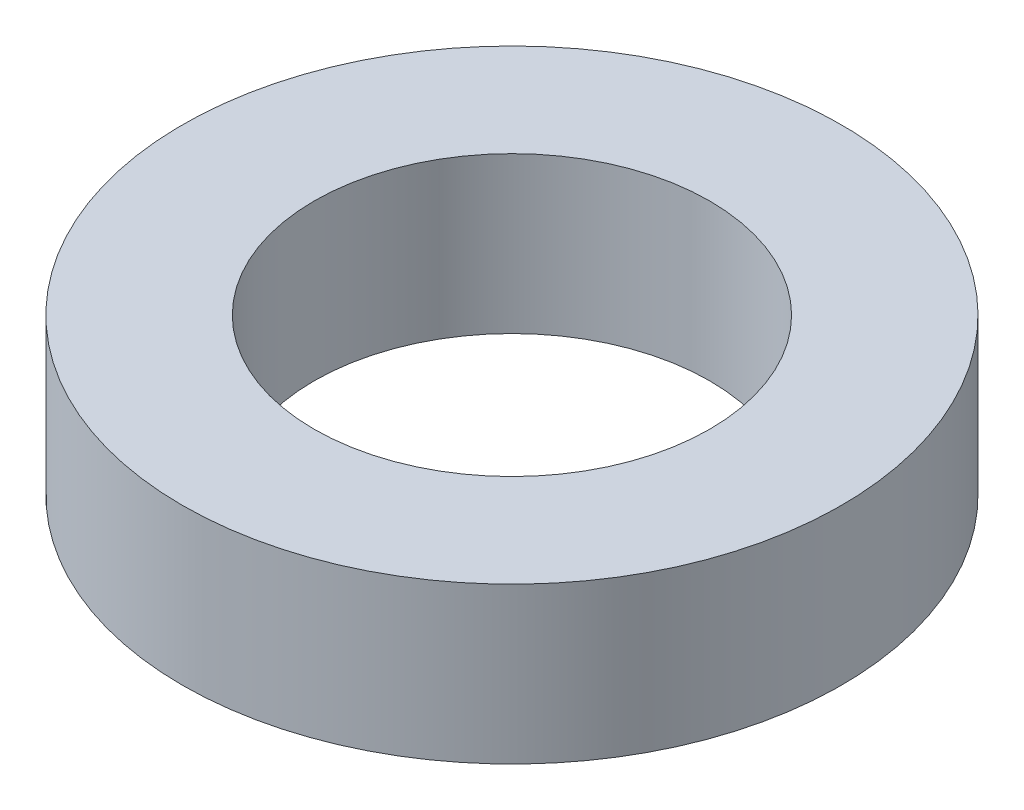
ISO-10303-21;
HEADER;
FILE_DESCRIPTION(('STEP AP214'),'2;1');
FILE_NAME('part.step','',(''),(''),'','','');
FILE_SCHEMA(('AUTOMOTIVE_DESIGN { 1 0 10303 214 1 1 1 1 }'));
ENDSEC;
DATA;
#1=APPLICATION_CONTEXT('core data for automotive mechanical design processes');
#2=APPLICATION_PROTOCOL_DEFINITION('international standard','automotive_design',2000,#1);
#3=PRODUCT_CONTEXT('',#1,'mechanical');
#4=PRODUCT('Part','Part','',(#3));
#5=PRODUCT_RELATED_PRODUCT_CATEGORY('part','',(#4));
#6=PRODUCT_DEFINITION_FORMATION('','',#4);
#7=PRODUCT_DEFINITION_CONTEXT('part definition',#1,'design');
#8=PRODUCT_DEFINITION('design','',#6,#7);
#9=PRODUCT_DEFINITION_SHAPE('','',#8);
#10=(LENGTH_UNIT() NAMED_UNIT(*) SI_UNIT(.MILLI.,.METRE.));
#11=(NAMED_UNIT(*) PLANE_ANGLE_UNIT() SI_UNIT($,.RADIAN.));
#12=(NAMED_UNIT(*) SI_UNIT($,.STERADIAN.) SOLID_ANGLE_UNIT());
#13=UNCERTAINTY_MEASURE_WITH_UNIT(LENGTH_MEASURE(1.E-05),#10,'distance_accuracy_value','');
#14=(GEOMETRIC_REPRESENTATION_CONTEXT(3) GLOBAL_UNCERTAINTY_ASSIGNED_CONTEXT((#13)) GLOBAL_UNIT_ASSIGNED_CONTEXT((#10,
#11,#12)) REPRESENTATION_CONTEXT('',''));
#15=CARTESIAN_POINT('',(0.,0.,0.));
#16=DIRECTION('',(0.,0.,1.));
#17=DIRECTION('',(1.,0.,0.));
#18=AXIS2_PLACEMENT_3D('',#15,#16,#17);
#19=CARTESIAN_POINT('',(0.,1.3,0.));
#20=DIRECTION('',(0.,-1.,0.));
#21=DIRECTION('',(0.,0.,-1.));
#22=AXIS2_PLACEMENT_3D('',#19,#20,#21);
#23=CYLINDRICAL_SURFACE('',#22,2.75);
#24=CARTESIAN_POINT('',(0.,1.3,0.));
#25=DIRECTION('',(0.,1.,0.));
#26=DIRECTION('',(0.,0.,1.));
#27=AXIS2_PLACEMENT_3D('',#24,#25,#26);
#28=CIRCLE('',#27,2.75);
#29=CARTESIAN_POINT('',(0.,1.3,2.75));
#30=VERTEX_POINT('',#29);
#31=EDGE_CURVE('E10',#30,#30,#28,.T.);
#32=ORIENTED_EDGE('',*,*,#31,.F.);
#33=EDGE_LOOP('',(#32));
#34=FACE_BOUND('',#33,.T.);
#35=CARTESIAN_POINT('',(0.,0.,0.));
#36=DIRECTION('',(0.,1.,0.));
#37=DIRECTION('',(0.,0.,1.));
#38=AXIS2_PLACEMENT_3D('',#35,#36,#37);
#39=CIRCLE('',#38,2.75);
#40=CARTESIAN_POINT('',(0.,0.,2.75));
#41=VERTEX_POINT('',#40);
#42=EDGE_CURVE('E40',#41,#41,#39,.T.);
#43=ORIENTED_EDGE('',*,*,#42,.T.);
#44=EDGE_LOOP('',(#43));
#45=FACE_BOUND('',#44,.T.);
#46=ADVANCED_FACE('F37',(#34,#45),#23,.T.);
#47=CARTESIAN_POINT('',(0.,1.3,0.));
#48=DIRECTION('',(0.,1.,0.));
#49=DIRECTION('',(0.,0.,1.));
#50=AXIS2_PLACEMENT_3D('',#47,#48,#49);
#51=PLANE('',#50);
#52=CARTESIAN_POINT('',(0.,1.3,0.));
#53=DIRECTION('',(0.,-1.,0.));
#54=DIRECTION('',(0.,0.,-1.));
#55=AXIS2_PLACEMENT_3D('',#52,#53,#54);
#56=CIRCLE('',#55,1.65);
#57=CARTESIAN_POINT('',(0.,1.3,-1.65));
#58=VERTEX_POINT('',#57);
#59=EDGE_CURVE('E47',#58,#58,#56,.T.);
#60=ORIENTED_EDGE('',*,*,#59,.T.);
#61=EDGE_LOOP('',(#60));
#62=FACE_BOUND('',#61,.T.);
#63=ORIENTED_EDGE('',*,*,#31,.T.);
#64=EDGE_LOOP('',(#63));
#65=FACE_BOUND('',#64,.T.);
#66=ADVANCED_FACE('F55',(#62,#65),#51,.T.);
#67=CARTESIAN_POINT('',(0.,0.,0.));
#68=DIRECTION('',(0.,1.,0.));
#69=DIRECTION('',(0.,0.,1.));
#70=AXIS2_PLACEMENT_3D('',#67,#68,#69);
#71=PLANE('',#70);
#72=CARTESIAN_POINT('',(0.,0.,0.));
#73=DIRECTION('',(0.,-1.,0.));
#74=DIRECTION('',(0.,0.,-1.));
#75=AXIS2_PLACEMENT_3D('',#72,#73,#74);
#76=CIRCLE('',#75,1.65);
#77=CARTESIAN_POINT('',(0.,0.,-1.65));
#78=VERTEX_POINT('',#77);
#79=EDGE_CURVE('E49',#78,#78,#76,.T.);
#80=ORIENTED_EDGE('',*,*,#79,.F.);
#81=EDGE_LOOP('',(#80));
#82=FACE_BOUND('',#81,.T.);
#83=ORIENTED_EDGE('',*,*,#42,.F.);
#84=EDGE_LOOP('',(#83));
#85=FACE_BOUND('',#84,.T.);
#86=ADVANCED_FACE('F60',(#82,#85),#71,.F.);
#87=CARTESIAN_POINT('',(0.,1.3,0.));
#88=DIRECTION('',(0.,-1.,0.));
#89=DIRECTION('',(0.,0.,-1.));
#90=AXIS2_PLACEMENT_3D('',#87,#88,#89);
#91=CYLINDRICAL_SURFACE('',#90,1.65);
#92=ORIENTED_EDGE('',*,*,#59,.F.);
#93=EDGE_LOOP('',(#92));
#94=FACE_BOUND('',#93,.T.);
#95=ORIENTED_EDGE('',*,*,#79,.T.);
#96=EDGE_LOOP('',(#95));
#97=FACE_BOUND('',#96,.T.);
#98=ADVANCED_FACE('F57',(#94,#97),#91,.F.);
#99=CLOSED_SHELL('',(#46,#66,#86,#98));
#100=MANIFOLD_SOLID_BREP('B2',#99);
#101=ADVANCED_BREP_SHAPE_REPRESENTATION('',(#18,#100),#14);
#102=SHAPE_DEFINITION_REPRESENTATION(#9,#101);
ENDSEC;
END-ISO-10303-21;
